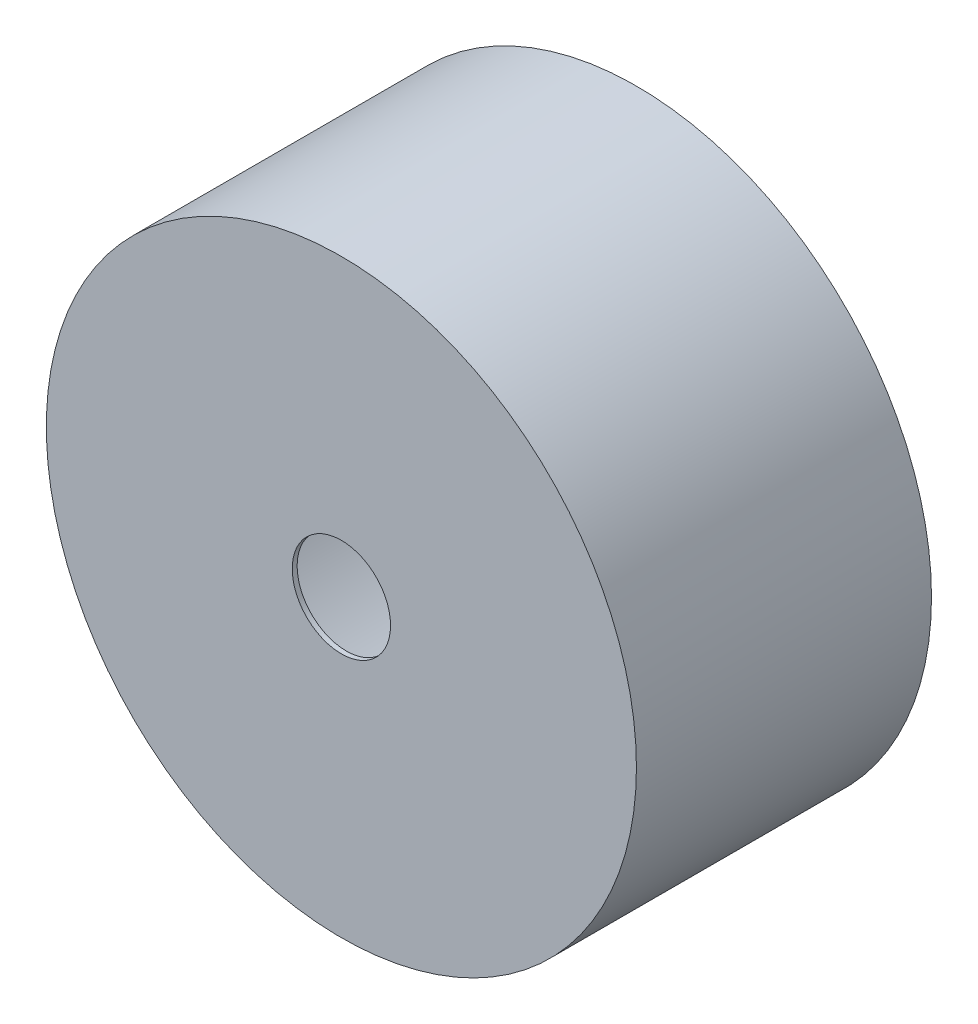
ISO-10303-21;
HEADER;
FILE_DESCRIPTION(('STEP AP214'),'2;1');
FILE_NAME('part.step','',(''),(''),'','','');
FILE_SCHEMA(('AUTOMOTIVE_DESIGN { 1 0 10303 214 1 1 1 1 }'));
ENDSEC;
DATA;
#1=APPLICATION_CONTEXT('core data for automotive mechanical design processes');
#2=APPLICATION_PROTOCOL_DEFINITION('international standard','automotive_design',2000,#1);
#3=PRODUCT_CONTEXT('',#1,'mechanical');
#4=PRODUCT('Part','Part','',(#3));
#5=PRODUCT_RELATED_PRODUCT_CATEGORY('part','',(#4));
#6=PRODUCT_DEFINITION_FORMATION('','',#4);
#7=PRODUCT_DEFINITION_CONTEXT('part definition',#1,'design');
#8=PRODUCT_DEFINITION('design','',#6,#7);
#9=PRODUCT_DEFINITION_SHAPE('','',#8);
#10=(LENGTH_UNIT() NAMED_UNIT(*) SI_UNIT(.MILLI.,.METRE.));
#11=(NAMED_UNIT(*) PLANE_ANGLE_UNIT() SI_UNIT($,.RADIAN.));
#12=(NAMED_UNIT(*) SI_UNIT($,.STERADIAN.) SOLID_ANGLE_UNIT());
#13=UNCERTAINTY_MEASURE_WITH_UNIT(LENGTH_MEASURE(1.E-05),#10,'distance_accuracy_value','');
#14=(GEOMETRIC_REPRESENTATION_CONTEXT(3) GLOBAL_UNCERTAINTY_ASSIGNED_CONTEXT((#13)) GLOBAL_UNIT_ASSIGNED_CONTEXT((#10,
#11,#12)) REPRESENTATION_CONTEXT('',''));
#15=CARTESIAN_POINT('',(0.,0.,0.));
#16=DIRECTION('',(0.,0.,1.));
#17=DIRECTION('',(1.,0.,0.));
#18=AXIS2_PLACEMENT_3D('',#15,#16,#17);
#19=CARTESIAN_POINT('',(0.,0.,3.));
#20=DIRECTION('',(0.,0.,-1.));
#21=DIRECTION('',(-1.,0.,0.));
#22=AXIS2_PLACEMENT_3D('',#19,#20,#21);
#23=CYLINDRICAL_SURFACE('',#22,3.);
#24=CARTESIAN_POINT('',(0.,0.,3.));
#25=DIRECTION('',(0.,0.,1.));
#26=DIRECTION('',(1.,0.,0.));
#27=AXIS2_PLACEMENT_3D('',#24,#25,#26);
#28=CIRCLE('',#27,3.);
#29=CARTESIAN_POINT('',(3.,0.,3.));
#30=VERTEX_POINT('',#29);
#31=EDGE_CURVE('E10',#30,#30,#28,.T.);
#32=ORIENTED_EDGE('',*,*,#31,.F.);
#33=EDGE_LOOP('',(#32));
#34=FACE_BOUND('',#33,.T.);
#35=CARTESIAN_POINT('',(0.,0.,0.));
#36=DIRECTION('',(0.,0.,1.));
#37=DIRECTION('',(1.,0.,0.));
#38=AXIS2_PLACEMENT_3D('',#35,#36,#37);
#39=CIRCLE('',#38,3.);
#40=CARTESIAN_POINT('',(3.,0.,0.));
#41=VERTEX_POINT('',#40);
#42=EDGE_CURVE('E51',#41,#41,#39,.T.);
#43=ORIENTED_EDGE('',*,*,#42,.T.);
#44=EDGE_LOOP('',(#43));
#45=FACE_BOUND('',#44,.T.);
#46=ADVANCED_FACE('F43',(#34,#45),#23,.T.);
#47=CARTESIAN_POINT('',(0.,0.,3.));
#48=DIRECTION('',(0.,0.,1.));
#49=DIRECTION('',(1.,0.,0.));
#50=AXIS2_PLACEMENT_3D('',#47,#48,#49);
#51=PLANE('',#50);
#52=CARTESIAN_POINT('',(0.,0.,3.));
#53=DIRECTION('',(0.,0.,1.));
#54=DIRECTION('',(1.,0.,0.));
#55=AXIS2_PLACEMENT_3D('',#52,#53,#54);
#56=CIRCLE('',#55,0.5);
#57=CARTESIAN_POINT('',(0.5,0.,3.));
#58=VERTEX_POINT('',#57);
#59=EDGE_CURVE('E66',#58,#58,#56,.T.);
#60=ORIENTED_EDGE('',*,*,#59,.F.);
#61=EDGE_LOOP('',(#60));
#62=FACE_BOUND('',#61,.T.);
#63=ORIENTED_EDGE('',*,*,#31,.T.);
#64=EDGE_LOOP('',(#63));
#65=FACE_BOUND('',#64,.T.);
#66=ADVANCED_FACE('F92',(#62,#65),#51,.T.);
#67=CARTESIAN_POINT('',(0.,0.,0.));
#68=DIRECTION('',(0.,0.,1.));
#69=DIRECTION('',(1.,0.,0.));
#70=AXIS2_PLACEMENT_3D('',#67,#68,#69);
#71=PLANE('',#70);
#72=CARTESIAN_POINT('',(0.,0.,0.));
#73=DIRECTION('',(0.,0.,-1.));
#74=DIRECTION('',(-1.,0.,0.));
#75=AXIS2_PLACEMENT_3D('',#72,#73,#74);
#76=CIRCLE('',#75,2.5);
#77=CARTESIAN_POINT('',(-2.5,0.,0.));
#78=VERTEX_POINT('',#77);
#79=EDGE_CURVE('E59',#78,#78,#76,.T.);
#80=ORIENTED_EDGE('',*,*,#79,.F.);
#81=EDGE_LOOP('',(#80));
#82=FACE_BOUND('',#81,.T.);
#83=ORIENTED_EDGE('',*,*,#42,.F.);
#84=EDGE_LOOP('',(#83));
#85=FACE_BOUND('',#84,.T.);
#86=ADVANCED_FACE('F86',(#82,#85),#71,.F.);
#87=CARTESIAN_POINT('',(0.,0.,2.95));
#88=DIRECTION('',(0.,0.,-1.));
#89=DIRECTION('',(-1.,0.,0.));
#90=AXIS2_PLACEMENT_3D('',#87,#88,#89);
#91=CYLINDRICAL_SURFACE('',#90,2.5);
#92=CARTESIAN_POINT('',(0.,0.,2.95));
#93=DIRECTION('',(0.,0.,-1.));
#94=DIRECTION('',(-1.,0.,0.));
#95=AXIS2_PLACEMENT_3D('',#92,#93,#94);
#96=CIRCLE('',#95,2.5);
#97=CARTESIAN_POINT('',(-2.5,0.,2.95));
#98=VERTEX_POINT('',#97);
#99=EDGE_CURVE('E57',#98,#98,#96,.T.);
#100=ORIENTED_EDGE('',*,*,#99,.F.);
#101=EDGE_LOOP('',(#100));
#102=FACE_BOUND('',#101,.T.);
#103=ORIENTED_EDGE('',*,*,#79,.T.);
#104=EDGE_LOOP('',(#103));
#105=FACE_BOUND('',#104,.T.);
#106=ADVANCED_FACE('F80',(#102,#105),#91,.F.);
#107=CARTESIAN_POINT('',(0.,0.,2.95));
#108=DIRECTION('',(0.,0.,-1.));
#109=DIRECTION('',(-1.,0.,0.));
#110=AXIS2_PLACEMENT_3D('',#107,#108,#109);
#111=PLANE('',#110);
#112=CARTESIAN_POINT('',(0.,0.,2.95));
#113=DIRECTION('',(0.,0.,-1.));
#114=DIRECTION('',(-1.,0.,0.));
#115=AXIS2_PLACEMENT_3D('',#112,#113,#114);
#116=CIRCLE('',#115,0.5);
#117=CARTESIAN_POINT('',(-0.5,0.,2.95));
#118=VERTEX_POINT('',#117);
#119=EDGE_CURVE('E46',#118,#118,#116,.T.);
#120=ORIENTED_EDGE('',*,*,#119,.F.);
#121=EDGE_LOOP('',(#120));
#122=FACE_BOUND('',#121,.T.);
#123=ORIENTED_EDGE('',*,*,#99,.T.);
#124=EDGE_LOOP('',(#123));
#125=FACE_BOUND('',#124,.T.);
#126=ADVANCED_FACE('F77',(#122,#125),#111,.T.);
#127=CARTESIAN_POINT('',(0.,0.,0.));
#128=DIRECTION('',(0.,0.,1.));
#129=DIRECTION('',(1.,0.,0.));
#130=AXIS2_PLACEMENT_3D('',#127,#128,#129);
#131=CYLINDRICAL_SURFACE('',#130,0.5);
#132=ORIENTED_EDGE('',*,*,#119,.T.);
#133=EDGE_LOOP('',(#132));
#134=FACE_BOUND('',#133,.T.);
#135=ORIENTED_EDGE('',*,*,#59,.T.);
#136=EDGE_LOOP('',(#135));
#137=FACE_BOUND('',#136,.T.);
#138=ADVANCED_FACE('F75',(#134,#137),#131,.F.);
#139=CLOSED_SHELL('',(#46,#66,#86,#106,#126,#138));
#140=MANIFOLD_SOLID_BREP('B2',#139);
#141=ADVANCED_BREP_SHAPE_REPRESENTATION('',(#18,#140),#14);
#142=SHAPE_DEFINITION_REPRESENTATION(#9,#141);
ENDSEC;
END-ISO-10303-21;
